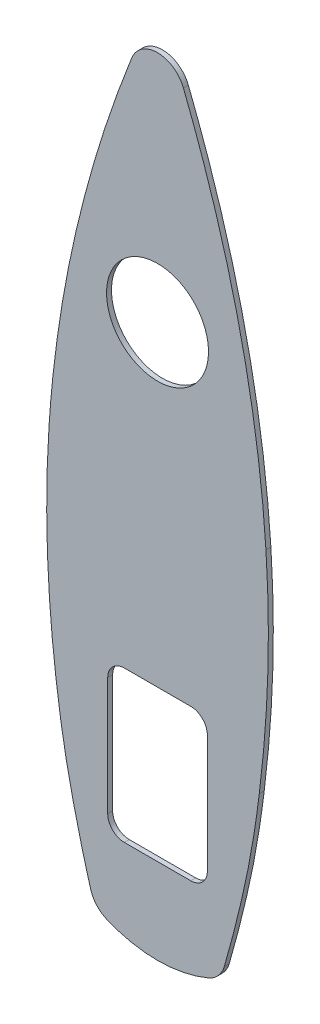
ISO-10303-21;
HEADER;
FILE_DESCRIPTION(('STEP AP214'),'2;1');
FILE_NAME('part.step','',(''),(''),'','','');
FILE_SCHEMA(('AUTOMOTIVE_DESIGN { 1 0 10303 214 1 1 1 1 }'));
ENDSEC;
DATA;
#1=APPLICATION_CONTEXT('core data for automotive mechanical design processes');
#2=APPLICATION_PROTOCOL_DEFINITION('international standard','automotive_design',2000,#1);
#3=PRODUCT_CONTEXT('',#1,'mechanical');
#4=PRODUCT('Part','Part','',(#3));
#5=PRODUCT_RELATED_PRODUCT_CATEGORY('part','',(#4));
#6=PRODUCT_DEFINITION_FORMATION('','',#4);
#7=PRODUCT_DEFINITION_CONTEXT('part definition',#1,'design');
#8=PRODUCT_DEFINITION('design','',#6,#7);
#9=PRODUCT_DEFINITION_SHAPE('','',#8);
#10=(LENGTH_UNIT() NAMED_UNIT(*) SI_UNIT(.MILLI.,.METRE.));
#11=(NAMED_UNIT(*) PLANE_ANGLE_UNIT() SI_UNIT($,.RADIAN.));
#12=(NAMED_UNIT(*) SI_UNIT($,.STERADIAN.) SOLID_ANGLE_UNIT());
#13=UNCERTAINTY_MEASURE_WITH_UNIT(LENGTH_MEASURE(1.E-05),#10,'distance_accuracy_value','');
#14=(GEOMETRIC_REPRESENTATION_CONTEXT(3) GLOBAL_UNCERTAINTY_ASSIGNED_CONTEXT((#13)) GLOBAL_UNIT_ASSIGNED_CONTEXT((#10,
#11,#12)) REPRESENTATION_CONTEXT('',''));
#15=CARTESIAN_POINT('',(0.,0.,0.));
#16=DIRECTION('',(0.,0.,1.));
#17=DIRECTION('',(1.,0.,0.));
#18=AXIS2_PLACEMENT_3D('',#15,#16,#17);
#19=CARTESIAN_POINT('',(-169.07570062882,-111.71211736926,-9.525));
#20=DIRECTION('',(0.,0.,1.));
#21=DIRECTION('',(1.,0.,0.));
#22=AXIS2_PLACEMENT_3D('',#19,#20,#21);
#23=PLANE('',#22);
#24=CARTESIAN_POINT('',(-196.097381589858,50.8000000000001,-9.525));
#25=CARTESIAN_POINT('',(-194.466912187164,37.7211454825166,-9.525));
#26=CARTESIAN_POINT('',(-190.233865689796,5.92326819002525,-9.525));
#27=CARTESIAN_POINT('',(-182.43760031694,-44.4187056096988,-9.525));
#28=CARTESIAN_POINT('',(-173.662799668192,-90.6349064624784,-9.525));
#29=CARTESIAN_POINT('',(-165.684623460225,-127.462722699776,-9.525));
#30=CARTESIAN_POINT('',(-159.273671103967,-155.047248490018,-9.525));
#31=CARTESIAN_POINT('',(-152.54164904012,-182.662401272934,-9.525));
#32=CARTESIAN_POINT('',(-145.58749855478,-210.232026724361,-9.525));
#33=CARTESIAN_POINT('',(-138.372363082365,-237.609630025993,-9.525));
#34=CARTESIAN_POINT('',(-132.92675238019,-256.894775015063,-9.525));
#35=CARTESIAN_POINT('',(-129.60700992947,-268.248148567474,-9.525));
#36=CARTESIAN_POINT('',(-128.929001137136,-270.550670561153,-9.525));
#37=CARTESIAN_POINT('',(-128.594557170708,-271.683003432127,-9.525));
#38=B_SPLINE_CURVE_WITH_KNOTS('',3,(#24,#25,#26,#27,#28,#29,#30,#31,#32,#33,#34,#35,#36,#37),
.UNSPECIFIED.,.F.,.F.,(4,1,1,1,1,1,1,1,1,1,1,4),(0.178448908542839,0.221760146261154,
0.283875320117554,0.345990493973954,0.377048080902154,0.408105667830354,0.439163254758554,
0.470220841686754,0.501278428614955,0.532336015543155,0.536350430203491,0.540232628569516),.UNSPECIFIED.);
#39=CARTESIAN_POINT('',(-196.097381589858,50.8000000000001,-9.525));
#40=VERTEX_POINT('',#39);
#41=CARTESIAN_POINT('',(-128.594557170708,-271.683003432127,-9.525));
#42=VERTEX_POINT('',#41);
#43=EDGE_CURVE('E179',#40,#42,#38,.T.);
#44=ORIENTED_EDGE('',*,*,#43,.F.);
#45=CARTESIAN_POINT('',(-208.92314552271,463.823648230864,-9.525));
#46=CARTESIAN_POINT('',(-210.176488679668,444.979630563106,-9.525));
#47=CARTESIAN_POINT('',(-212.168857378131,407.250169642296,-9.525));
#48=CARTESIAN_POINT('',(-214.13290576606,331.756352430611,-9.525));
#49=CARTESIAN_POINT('',(-213.041680780729,256.162202934723,-9.525));
#50=CARTESIAN_POINT('',(-208.913068108199,180.752800745102,-9.525));
#51=CARTESIAN_POINT('',(-204.336033540581,124.225867737426,-9.525));
#52=CARTESIAN_POINT('',(-199.763447663843,80.9264416222707,-9.525));
#53=CARTESIAN_POINT('',(-196.805263519319,56.4782940886052,-9.525));
#54=CARTESIAN_POINT('',(-196.097381589858,50.8000000000001,-9.525));
#55=B_SPLINE_CURVE_WITH_KNOTS('',3,(#45,#46,#47,#48,#49,#50,#51,#52,#53,#54),.UNSPECIFIED.,.F.,
.F.,(4,1,1,1,1,1,1,4),(0.540232628569516,0.602347802425916,0.664462976282317,0.788693323995117,
0.850808497851517,0.912923671707918,0.975038845564318,0.993842781702403),.UNSPECIFIED.);
#56=CARTESIAN_POINT('',(-208.92314552271,463.823648230864,-9.525));
#57=VERTEX_POINT('',#56);
#58=EDGE_CURVE('E173',#57,#40,#55,.T.);
#59=ORIENTED_EDGE('',*,*,#58,.F.);
#60=CARTESIAN_POINT('',(-49.8587186123013,1155.17345557115,-9.525));
#61=CARTESIAN_POINT('',(-50.0302403870393,1154.73560842821,-9.525));
#62=CARTESIAN_POINT('',(-51.5170168797644,1150.938010972,-9.525));
#63=CARTESIAN_POINT('',(-54.3644267921593,1143.62077292858,-9.525));
#64=CARTESIAN_POINT('',(-58.4009920401104,1133.20563378004,-9.525));
#65=CARTESIAN_POINT('',(-66.4915866512016,1112.15093240454,-9.525));
#66=CARTESIAN_POINT('',(-78.262605190458,1080.4804198646,-9.525));
#67=CARTESIAN_POINT('',(-93.1475011129892,1037.90347260421,-9.525));
#68=CARTESIAN_POINT('',(-111.913437804513,980.768947108171,-9.525));
#69=CARTESIAN_POINT('',(-133.34925540427,908.643148931544,-9.525));
#70=CARTESIAN_POINT('',(-152.011482075015,835.667387936842,-9.525));
#71=CARTESIAN_POINT('',(-165.195396161111,776.883168245489,-9.525));
#72=CARTESIAN_POINT('',(-177.216824309124,717.77767186812,-9.525));
#73=CARTESIAN_POINT('',(-189.991146999518,643.543237919497,-9.525));
#74=CARTESIAN_POINT('',(-199.706639723368,568.910060357193,-9.525));
#75=CARTESIAN_POINT('',(-205.602175882465,508.953742276428,-9.525));
#76=CARTESIAN_POINT('',(-207.922427582032,478.869564138098,-9.525));
#77=CARTESIAN_POINT('',(-208.92314552271,463.823648230864,-9.525));
#78=B_SPLINE_CURVE_WITH_KNOTS('',3,(#60,#61,#62,#63,#64,#65,#66,#67,#68,#69,#70,#71,#72,#73,#74,
#75,#76,#77),.UNSPECIFIED.,.F.,.F.,(4,1,1,1,1,1,1,1,1,1,1,1,1,1,1,4),(0.,0.0019525801139515,
0.0169372392647247,0.0325578801763373,0.0481785210879501,0.110661084734401,0.173143648380851,
0.235626212027302,0.360591339320203,0.485556466613104,0.548039030259555,0.610521593906006,
0.735486721198907,0.860451848491808,0.922934412138259,0.98541697578471),.UNSPECIFIED.);
#79=CARTESIAN_POINT('',(-49.8587186123014,1155.17345557115,-9.525));
#80=VERTEX_POINT('',#79);
#81=EDGE_CURVE('E246',#80,#57,#78,.T.);
#82=ORIENTED_EDGE('',*,*,#81,.F.);
#83=CARTESIAN_POINT('',(0.,1135.64185396908,-9.525));
#84=DIRECTION('',(0.,0.,1.));
#85=DIRECTION('',(1.,0.,0.));
#86=AXIS2_PLACEMENT_3D('',#83,#84,#85);
#87=CIRCLE('',#86,53.5478784155137);
#88=CARTESIAN_POINT('',(49.8587186123014,1155.17345557115,-9.525));
#89=VERTEX_POINT('',#88);
#90=EDGE_CURVE('E569',#89,#80,#87,.T.);
#91=ORIENTED_EDGE('',*,*,#90,.F.);
#92=CARTESIAN_POINT('',(208.92314552271,463.823648230864,-9.525));
#93=CARTESIAN_POINT('',(207.922427582032,478.869564138098,-9.525));
#94=CARTESIAN_POINT('',(205.602175882466,508.953742276428,-9.525));
#95=CARTESIAN_POINT('',(199.706639723368,568.910060357193,-9.525));
#96=CARTESIAN_POINT('',(189.991146999518,643.543237919497,-9.525));
#97=CARTESIAN_POINT('',(177.216824309124,717.77767186812,-9.525));
#98=CARTESIAN_POINT('',(165.195396161111,776.883168245489,-9.525));
#99=CARTESIAN_POINT('',(152.011482075015,835.667387936842,-9.525));
#100=CARTESIAN_POINT('',(133.349255404271,908.643148931544,-9.525));
#101=CARTESIAN_POINT('',(111.913437804513,980.768947108171,-9.525));
#102=CARTESIAN_POINT('',(93.1475011129891,1037.90347260421,-9.525));
#103=CARTESIAN_POINT('',(78.2626051904581,1080.4804198646,-9.525));
#104=CARTESIAN_POINT('',(66.4915866512016,1112.15093240454,-9.525));
#105=CARTESIAN_POINT('',(58.4009920401104,1133.20563378004,-9.525));
#106=CARTESIAN_POINT('',(54.3644267921593,1143.62077292858,-9.525));
#107=CARTESIAN_POINT('',(51.5170168797644,1150.938010972,-9.525));
#108=CARTESIAN_POINT('',(50.0302403870394,1154.73560842821,-9.525));
#109=CARTESIAN_POINT('',(49.8587186123014,1155.17345557115,-9.525));
#110=B_SPLINE_CURVE_WITH_KNOTS('',3,(#92,#93,#94,#95,#96,#97,#98,#99,#100,#101,#102,#103,#104,
#105,#106,#107,#108,#109),.UNSPECIFIED.,.F.,.F.,(4,1,1,1,1,1,1,1,1,1,1,1,1,1,1,4),(0.,
0.0624825636464506,0.124965127292901,0.249930254585803,0.374895381878704,0.437377945525154,
0.499860509171605,0.624825636464506,0.749790763757408,0.812273327403858,0.874755891050309,
0.937238454696759,0.952859095608372,0.968479736519985,0.983464395670758,0.98541697578471),.UNSPECIFIED.);
#111=CARTESIAN_POINT('',(208.92314552271,463.823648230864,-9.525));
#112=VERTEX_POINT('',#111);
#113=EDGE_CURVE('E572',#112,#89,#110,.T.);
#114=ORIENTED_EDGE('',*,*,#113,.F.);
#115=CARTESIAN_POINT('',(196.097381589858,50.8,-9.525));
#116=CARTESIAN_POINT('',(196.805263519319,56.4782940886051,-9.525));
#117=CARTESIAN_POINT('',(199.763447663843,80.9264416222707,-9.525));
#118=CARTESIAN_POINT('',(204.336033540581,124.225867737426,-9.525));
#119=CARTESIAN_POINT('',(208.913068108199,180.752800745102,-9.525));
#120=CARTESIAN_POINT('',(213.041680780729,256.162202934723,-9.525));
#121=CARTESIAN_POINT('',(214.13290576606,331.756352430611,-9.525));
#122=CARTESIAN_POINT('',(212.168857378131,407.250169642296,-9.525));
#123=CARTESIAN_POINT('',(210.176488679668,444.979630563106,-9.525));
#124=CARTESIAN_POINT('',(208.92314552271,463.823648230864,-9.525));
#125=B_SPLINE_CURVE_WITH_KNOTS('',3,(#115,#116,#117,#118,#119,#120,#121,#122,#123,#124),
.UNSPECIFIED.,.F.,.F.,(4,1,1,1,1,1,1,4),(0.540232628569516,0.559036564707602,0.621151738564002,
0.683266912420402,0.745382086276803,0.869612433989603,0.931727607846003,0.993842781702403),.UNSPECIFIED.);
#126=CARTESIAN_POINT('',(196.097381589858,50.8,-9.525));
#127=VERTEX_POINT('',#126);
#128=EDGE_CURVE('E573',#127,#112,#125,.T.);
#129=ORIENTED_EDGE('',*,*,#128,.F.);
#130=CARTESIAN_POINT('',(128.594557170708,-271.683003432127,-9.525));
#131=CARTESIAN_POINT('',(128.929001137136,-270.550670561153,-9.525));
#132=CARTESIAN_POINT('',(129.60700992947,-268.248148567474,-9.525));
#133=CARTESIAN_POINT('',(132.92675238019,-256.894775015063,-9.525));
#134=CARTESIAN_POINT('',(138.372363082365,-237.609630025993,-9.525));
#135=CARTESIAN_POINT('',(145.58749855478,-210.232026724361,-9.525));
#136=CARTESIAN_POINT('',(152.54164904012,-182.662401272934,-9.525));
#137=CARTESIAN_POINT('',(159.273671103967,-155.047248490018,-9.525));
#138=CARTESIAN_POINT('',(165.684623460225,-127.462722699776,-9.525));
#139=CARTESIAN_POINT('',(173.662799668192,-90.6349064624784,-9.525));
#140=CARTESIAN_POINT('',(182.43760031694,-44.4187056096988,-9.525));
#141=CARTESIAN_POINT('',(190.233865689796,5.92326819002522,-9.525));
#142=CARTESIAN_POINT('',(194.466912187164,37.7211454825165,-9.525));
#143=CARTESIAN_POINT('',(196.097381589858,50.8,-9.525));
#144=B_SPLINE_CURVE_WITH_KNOTS('',3,(#130,#131,#132,#133,#134,#135,#136,#137,#138,#139,#140,
#141,#142,#143),.UNSPECIFIED.,.F.,.F.,(4,1,1,1,1,1,1,1,1,1,1,4),(0.178448908542839,
0.182331106908864,0.186345521569201,0.217403108497401,0.248460695425601,0.279518282353801,
0.310575869282001,0.341633456210201,0.372691043138401,0.434806216994801,0.496921390851202,
0.540232628569516),.UNSPECIFIED.);
#145=CARTESIAN_POINT('',(128.594557170708,-271.683003432127,-9.525));
#146=VERTEX_POINT('',#145);
#147=EDGE_CURVE('E586',#146,#127,#144,.T.);
#148=ORIENTED_EDGE('',*,*,#147,.F.);
#149=CARTESIAN_POINT('',(77.2378166373503,-256.514361377239,-9.525));
#150=DIRECTION('',(0.,0.,1.));
#151=DIRECTION('',(1.,0.,0.));
#152=AXIS2_PLACEMENT_3D('',#149,#150,#151);
#153=CIRCLE('',#152,53.5499999999992);
#154=CARTESIAN_POINT('',(98.0313358756742,-305.862431832783,-9.525));
#155=VERTEX_POINT('',#154);
#156=EDGE_CURVE('E592',#155,#146,#153,.T.);
#157=ORIENTED_EDGE('',*,*,#156,.F.);
#158=CARTESIAN_POINT('',(0.,-73.210266790526,-9.525));
#159=DIRECTION('',(0.,0.,1.));
#160=DIRECTION('',(1.,0.,0.));
#161=AXIS2_PLACEMENT_3D('',#158,#159,#160);
#162=CIRCLE('',#161,252.46222036657);
#163=CARTESIAN_POINT('',(-98.0313358756743,-305.862431832783,-9.525));
#164=VERTEX_POINT('',#163);
#165=EDGE_CURVE('E183',#164,#155,#162,.T.);
#166=ORIENTED_EDGE('',*,*,#165,.F.);
#167=CARTESIAN_POINT('',(-77.2378166373503,-256.514361377239,-9.525));
#168=DIRECTION('',(0.,0.,1.));
#169=DIRECTION('',(1.,0.,0.));
#170=AXIS2_PLACEMENT_3D('',#167,#168,#169);
#171=CIRCLE('',#170,53.5499999999992);
#172=EDGE_CURVE('E165',#42,#164,#171,.T.);
#173=ORIENTED_EDGE('',*,*,#172,.F.);
#174=EDGE_LOOP('',(#44,#59,#82,#91,#114,#129,#148,#157,#166,#173));
#175=FACE_BOUND('',#174,.T.);
#176=DIRECTION('',(-1.,0.,0.));
#177=VECTOR('',#176,1.);
#178=CARTESIAN_POINT('',(-169.07570062882,-160.672487157329,-9.525));
#179=LINE('',#178,#177);
#180=CARTESIAN_POINT('',(64.,-160.672487157329,-9.525));
#181=VERTEX_POINT('',#180);
#182=CARTESIAN_POINT('',(-64.,-160.672487157329,-9.525));
#183=VERTEX_POINT('',#182);
#184=EDGE_CURVE('E339',#181,#183,#179,.T.);
#185=ORIENTED_EDGE('',*,*,#184,.F.);
#186=CARTESIAN_POINT('',(64.,-128.672487157329,-9.525));
#187=DIRECTION('',(0.,0.,1.));
#188=DIRECTION('',(1.,0.,0.));
#189=AXIS2_PLACEMENT_3D('',#186,#187,#188);
#190=CIRCLE('',#189,32.);
#191=CARTESIAN_POINT('',(96.,-128.672487157329,-9.525));
#192=VERTEX_POINT('',#191);
#193=EDGE_CURVE('E358',#181,#192,#190,.T.);
#194=ORIENTED_EDGE('',*,*,#193,.T.);
#195=DIRECTION('',(0.,-1.,0.));
#196=VECTOR('',#195,1.);
#197=CARTESIAN_POINT('',(96.,-111.71211736926,-9.525));
#198=LINE('',#197,#196);
#199=CARTESIAN_POINT('',(96.,98.3275128426711,-9.525));
#200=VERTEX_POINT('',#199);
#201=EDGE_CURVE('E375',#200,#192,#198,.T.);
#202=ORIENTED_EDGE('',*,*,#201,.F.);
#203=CARTESIAN_POINT('',(64.,98.3275128426712,-9.525));
#204=DIRECTION('',(0.,0.,1.));
#205=DIRECTION('',(1.,0.,0.));
#206=AXIS2_PLACEMENT_3D('',#203,#204,#205);
#207=CIRCLE('',#206,32.);
#208=CARTESIAN_POINT('',(64.,130.327512842671,-9.525));
#209=VERTEX_POINT('',#208);
#210=EDGE_CURVE('E362',#200,#209,#207,.T.);
#211=ORIENTED_EDGE('',*,*,#210,.T.);
#212=DIRECTION('',(-1.,0.,0.));
#213=VECTOR('',#212,1.);
#214=CARTESIAN_POINT('',(-169.07570062882,130.327512842671,-9.525));
#215=LINE('',#214,#213);
#216=CARTESIAN_POINT('',(-64.,130.327512842671,-9.525));
#217=VERTEX_POINT('',#216);
#218=EDGE_CURVE('E389',#209,#217,#215,.T.);
#219=ORIENTED_EDGE('',*,*,#218,.T.);
#220=CARTESIAN_POINT('',(-64.,98.3275128426712,-9.525));
#221=DIRECTION('',(0.,0.,1.));
#222=DIRECTION('',(1.,0.,0.));
#223=AXIS2_PLACEMENT_3D('',#220,#221,#222);
#224=CIRCLE('',#223,32.);
#225=CARTESIAN_POINT('',(-96.,98.3275128426711,-9.525));
#226=VERTEX_POINT('',#225);
#227=EDGE_CURVE('E59',#217,#226,#224,.T.);
#228=ORIENTED_EDGE('',*,*,#227,.T.);
#229=DIRECTION('',(0.,-1.,0.));
#230=VECTOR('',#229,1.);
#231=CARTESIAN_POINT('',(-96.,-111.71211736926,-9.525));
#232=LINE('',#231,#230);
#233=CARTESIAN_POINT('',(-96.,-128.672487157329,-9.525));
#234=VERTEX_POINT('',#233);
#235=EDGE_CURVE('E371',#226,#234,#232,.T.);
#236=ORIENTED_EDGE('',*,*,#235,.T.);
#237=CARTESIAN_POINT('',(-64.,-128.672487157329,-9.525));
#238=DIRECTION('',(0.,0.,1.));
#239=DIRECTION('',(1.,0.,0.));
#240=AXIS2_PLACEMENT_3D('',#237,#238,#239);
#241=CIRCLE('',#240,32.);
#242=EDGE_CURVE('E45',#234,#183,#241,.T.);
#243=ORIENTED_EDGE('',*,*,#242,.T.);
#244=EDGE_LOOP('',(#185,#194,#202,#211,#219,#228,#236,#243));
#245=FACE_BOUND('',#244,.T.);
#246=CARTESIAN_POINT('',(0.,739.189732384592,-9.525));
#247=DIRECTION('',(0.,0.,1.));
#248=DIRECTION('',(1.,0.,0.));
#249=AXIS2_PLACEMENT_3D('',#246,#247,#248);
#250=CIRCLE('',#249,98.25);
#251=CARTESIAN_POINT('',(98.2500000000001,739.189732384592,-9.525));
#252=VERTEX_POINT('',#251);
#253=EDGE_CURVE('E196',#252,#252,#250,.F.);
#254=ORIENTED_EDGE('',*,*,#253,.F.);
#255=EDGE_LOOP('',(#254));
#256=FACE_BOUND('',#255,.T.);
#257=ADVANCED_FACE('F37',(#175,#245,#256),#23,.F.);
#258=CARTESIAN_POINT('',(-169.07570062882,-111.71211736926,0.));
#259=DIRECTION('',(0.,0.,1.));
#260=DIRECTION('',(1.,0.,0.));
#261=AXIS2_PLACEMENT_3D('',#258,#259,#260);
#262=PLANE('',#261);
#263=DIRECTION('',(-1.,0.,0.));
#264=VECTOR('',#263,1.);
#265=CARTESIAN_POINT('',(-169.07570062882,130.327512842671,0.));
#266=LINE('',#265,#264);
#267=CARTESIAN_POINT('',(64.,130.327512842671,0.));
#268=VERTEX_POINT('',#267);
#269=CARTESIAN_POINT('',(-64.,130.327512842671,0.));
#270=VERTEX_POINT('',#269);
#271=EDGE_CURVE('E326',#268,#270,#266,.T.);
#272=ORIENTED_EDGE('',*,*,#271,.F.);
#273=CARTESIAN_POINT('',(64.,98.3275128426712,0.));
#274=DIRECTION('',(0.,0.,1.));
#275=DIRECTION('',(1.,0.,0.));
#276=AXIS2_PLACEMENT_3D('',#273,#274,#275);
#277=CIRCLE('',#276,32.);
#278=CARTESIAN_POINT('',(96.,98.3275128426711,0.));
#279=VERTEX_POINT('',#278);
#280=EDGE_CURVE('E364',#268,#279,#277,.F.);
#281=ORIENTED_EDGE('',*,*,#280,.T.);
#282=DIRECTION('',(0.,-1.,0.));
#283=VECTOR('',#282,1.);
#284=CARTESIAN_POINT('',(96.,-111.71211736926,0.));
#285=LINE('',#284,#283);
#286=CARTESIAN_POINT('',(96.,-128.672487157329,0.));
#287=VERTEX_POINT('',#286);
#288=EDGE_CURVE('E329',#279,#287,#285,.T.);
#289=ORIENTED_EDGE('',*,*,#288,.T.);
#290=CARTESIAN_POINT('',(64.,-128.672487157329,0.));
#291=DIRECTION('',(0.,0.,1.));
#292=DIRECTION('',(1.,0.,0.));
#293=AXIS2_PLACEMENT_3D('',#290,#291,#292);
#294=CIRCLE('',#293,32.);
#295=CARTESIAN_POINT('',(64.,-160.672487157329,0.));
#296=VERTEX_POINT('',#295);
#297=EDGE_CURVE('E360',#287,#296,#294,.F.);
#298=ORIENTED_EDGE('',*,*,#297,.T.);
#299=DIRECTION('',(-1.,0.,0.));
#300=VECTOR('',#299,1.);
#301=CARTESIAN_POINT('',(-169.07570062882,-160.672487157329,0.));
#302=LINE('',#301,#300);
#303=CARTESIAN_POINT('',(-64.,-160.672487157329,0.));
#304=VERTEX_POINT('',#303);
#305=EDGE_CURVE('E332',#296,#304,#302,.T.);
#306=ORIENTED_EDGE('',*,*,#305,.T.);
#307=CARTESIAN_POINT('',(-64.,-128.672487157329,0.));
#308=DIRECTION('',(0.,0.,1.));
#309=DIRECTION('',(1.,0.,0.));
#310=AXIS2_PLACEMENT_3D('',#307,#308,#309);
#311=CIRCLE('',#310,32.);
#312=CARTESIAN_POINT('',(-96.,-128.672487157329,0.));
#313=VERTEX_POINT('',#312);
#314=EDGE_CURVE('E11',#304,#313,#311,.F.);
#315=ORIENTED_EDGE('',*,*,#314,.T.);
#316=DIRECTION('',(0.,-1.,0.));
#317=VECTOR('',#316,1.);
#318=CARTESIAN_POINT('',(-96.,-111.71211736926,0.));
#319=LINE('',#318,#317);
#320=CARTESIAN_POINT('',(-96.,98.3275128426711,0.));
#321=VERTEX_POINT('',#320);
#322=EDGE_CURVE('E308',#321,#313,#319,.T.);
#323=ORIENTED_EDGE('',*,*,#322,.F.);
#324=CARTESIAN_POINT('',(-64.,98.3275128426712,0.));
#325=DIRECTION('',(0.,0.,1.));
#326=DIRECTION('',(1.,0.,0.));
#327=AXIS2_PLACEMENT_3D('',#324,#325,#326);
#328=CIRCLE('',#327,32.);
#329=EDGE_CURVE('E367',#321,#270,#328,.F.);
#330=ORIENTED_EDGE('',*,*,#329,.T.);
#331=EDGE_LOOP('',(#272,#281,#289,#298,#306,#315,#323,#330));
#332=FACE_BOUND('',#331,.T.);
#333=CARTESIAN_POINT('',(-196.097381589858,50.8000000000001,0.));
#334=CARTESIAN_POINT('',(-194.466912187164,37.7211454825166,0.));
#335=CARTESIAN_POINT('',(-190.233865689796,5.92326819002525,0.));
#336=CARTESIAN_POINT('',(-182.43760031694,-44.4187056096988,0.));
#337=CARTESIAN_POINT('',(-173.662799668192,-90.6349064624784,0.));
#338=CARTESIAN_POINT('',(-165.684623460225,-127.462722699776,0.));
#339=CARTESIAN_POINT('',(-159.273671103967,-155.047248490018,0.));
#340=CARTESIAN_POINT('',(-152.54164904012,-182.662401272934,0.));
#341=CARTESIAN_POINT('',(-145.58749855478,-210.232026724361,0.));
#342=CARTESIAN_POINT('',(-138.372363082365,-237.609630025993,0.));
#343=CARTESIAN_POINT('',(-132.92675238019,-256.894775015063,0.));
#344=CARTESIAN_POINT('',(-129.60700992947,-268.248148567474,0.));
#345=CARTESIAN_POINT('',(-128.929001137136,-270.550670561153,0.));
#346=CARTESIAN_POINT('',(-128.594557170708,-271.683003432127,0.));
#347=B_SPLINE_CURVE_WITH_KNOTS('',3,(#333,#334,#335,#336,#337,#338,#339,#340,#341,#342,#343,
#344,#345,#346),.UNSPECIFIED.,.F.,.F.,(4,1,1,1,1,1,1,1,1,1,1,4),(0.178448908542839,
0.221760146261154,0.283875320117554,0.345990493973954,0.377048080902154,0.408105667830354,
0.439163254758554,0.470220841686754,0.501278428614955,0.532336015543155,0.536350430203491,
0.540232628569516),.UNSPECIFIED.);
#348=CARTESIAN_POINT('',(-196.097381589858,50.8000000000001,0.));
#349=VERTEX_POINT('',#348);
#350=CARTESIAN_POINT('',(-128.594557170708,-271.683003432127,0.));
#351=VERTEX_POINT('',#350);
#352=EDGE_CURVE('E251',#349,#351,#347,.T.);
#353=ORIENTED_EDGE('',*,*,#352,.T.);
#354=CARTESIAN_POINT('',(-77.2378166373503,-256.514361377239,0.));
#355=DIRECTION('',(0.,0.,1.));
#356=DIRECTION('',(1.,0.,0.));
#357=AXIS2_PLACEMENT_3D('',#354,#355,#356);
#358=CIRCLE('',#357,53.5499999999992);
#359=CARTESIAN_POINT('',(-98.0313358756743,-305.862431832783,0.));
#360=VERTEX_POINT('',#359);
#361=EDGE_CURVE('E167',#351,#360,#358,.T.);
#362=ORIENTED_EDGE('',*,*,#361,.T.);
#363=CARTESIAN_POINT('',(0.,-73.210266790526,0.));
#364=DIRECTION('',(0.,0.,1.));
#365=DIRECTION('',(1.,0.,0.));
#366=AXIS2_PLACEMENT_3D('',#363,#364,#365);
#367=CIRCLE('',#366,252.46222036657);
#368=CARTESIAN_POINT('',(98.0313358756742,-305.862431832783,0.));
#369=VERTEX_POINT('',#368);
#370=EDGE_CURVE('E262',#360,#369,#367,.T.);
#371=ORIENTED_EDGE('',*,*,#370,.T.);
#372=CARTESIAN_POINT('',(77.2378166373503,-256.514361377239,0.));
#373=DIRECTION('',(0.,0.,1.));
#374=DIRECTION('',(1.,0.,0.));
#375=AXIS2_PLACEMENT_3D('',#372,#373,#374);
#376=CIRCLE('',#375,53.5499999999992);
#377=CARTESIAN_POINT('',(128.594557170708,-271.683003432127,0.));
#378=VERTEX_POINT('',#377);
#379=EDGE_CURVE('E265',#369,#378,#376,.T.);
#380=ORIENTED_EDGE('',*,*,#379,.T.);
#381=CARTESIAN_POINT('',(128.594557170708,-271.683003432127,0.));
#382=CARTESIAN_POINT('',(128.929001137136,-270.550670561153,0.));
#383=CARTESIAN_POINT('',(129.60700992947,-268.248148567474,0.));
#384=CARTESIAN_POINT('',(132.92675238019,-256.894775015063,0.));
#385=CARTESIAN_POINT('',(138.372363082365,-237.609630025993,0.));
#386=CARTESIAN_POINT('',(145.58749855478,-210.232026724361,0.));
#387=CARTESIAN_POINT('',(152.54164904012,-182.662401272934,0.));
#388=CARTESIAN_POINT('',(159.273671103967,-155.047248490018,0.));
#389=CARTESIAN_POINT('',(165.684623460225,-127.462722699776,0.));
#390=CARTESIAN_POINT('',(173.662799668192,-90.6349064624784,0.));
#391=CARTESIAN_POINT('',(182.43760031694,-44.4187056096988,0.));
#392=CARTESIAN_POINT('',(190.233865689796,5.92326819002522,0.));
#393=CARTESIAN_POINT('',(194.466912187164,37.7211454825165,0.));
#394=CARTESIAN_POINT('',(196.097381589858,50.8,0.));
#395=B_SPLINE_CURVE_WITH_KNOTS('',3,(#381,#382,#383,#384,#385,#386,#387,#388,#389,#390,#391,
#392,#393,#394),.UNSPECIFIED.,.F.,.F.,(4,1,1,1,1,1,1,1,1,1,1,4),(0.178448908542839,
0.182331106908864,0.186345521569201,0.217403108497401,0.248460695425601,0.279518282353801,
0.310575869282001,0.341633456210201,0.372691043138401,0.434806216994801,0.496921390851202,
0.540232628569516),.UNSPECIFIED.);
#396=CARTESIAN_POINT('',(196.097381589858,50.8,0.));
#397=VERTEX_POINT('',#396);
#398=EDGE_CURVE('E268',#378,#397,#395,.T.);
#399=ORIENTED_EDGE('',*,*,#398,.T.);
#400=CARTESIAN_POINT('',(196.097381589858,50.8,0.));
#401=CARTESIAN_POINT('',(196.805263519319,56.4782940886051,0.));
#402=CARTESIAN_POINT('',(199.763447663843,80.9264416222707,0.));
#403=CARTESIAN_POINT('',(204.336033540581,124.225867737426,0.));
#404=CARTESIAN_POINT('',(208.913068108199,180.752800745102,0.));
#405=CARTESIAN_POINT('',(213.041680780729,256.162202934723,0.));
#406=CARTESIAN_POINT('',(214.13290576606,331.756352430611,0.));
#407=CARTESIAN_POINT('',(212.168857378131,407.250169642296,0.));
#408=CARTESIAN_POINT('',(210.176488679668,444.979630563106,0.));
#409=CARTESIAN_POINT('',(208.92314552271,463.823648230864,0.));
#410=B_SPLINE_CURVE_WITH_KNOTS('',3,(#400,#401,#402,#403,#404,#405,#406,#407,#408,#409),
.UNSPECIFIED.,.F.,.F.,(4,1,1,1,1,1,1,4),(0.540232628569516,0.559036564707602,0.621151738564002,
0.683266912420402,0.745382086276803,0.869612433989603,0.931727607846003,0.993842781702403),.UNSPECIFIED.);
#411=CARTESIAN_POINT('',(208.92314552271,463.823648230864,0.));
#412=VERTEX_POINT('',#411);
#413=EDGE_CURVE('E273',#397,#412,#410,.T.);
#414=ORIENTED_EDGE('',*,*,#413,.T.);
#415=CARTESIAN_POINT('',(208.92314552271,463.823648230864,0.));
#416=CARTESIAN_POINT('',(207.922427582032,478.869564138098,0.));
#417=CARTESIAN_POINT('',(205.602175882466,508.953742276428,0.));
#418=CARTESIAN_POINT('',(199.706639723368,568.910060357193,0.));
#419=CARTESIAN_POINT('',(189.991146999518,643.543237919497,0.));
#420=CARTESIAN_POINT('',(177.216824309124,717.77767186812,0.));
#421=CARTESIAN_POINT('',(165.195396161111,776.883168245489,0.));
#422=CARTESIAN_POINT('',(152.011482075015,835.667387936842,0.));
#423=CARTESIAN_POINT('',(133.349255404271,908.643148931544,0.));
#424=CARTESIAN_POINT('',(111.913437804513,980.768947108171,0.));
#425=CARTESIAN_POINT('',(93.1475011129891,1037.90347260421,0.));
#426=CARTESIAN_POINT('',(78.2626051904581,1080.4804198646,0.));
#427=CARTESIAN_POINT('',(66.4915866512016,1112.15093240454,0.));
#428=CARTESIAN_POINT('',(58.4009920401104,1133.20563378004,0.));
#429=CARTESIAN_POINT('',(54.3644267921593,1143.62077292858,0.));
#430=CARTESIAN_POINT('',(51.5170168797644,1150.938010972,0.));
#431=CARTESIAN_POINT('',(50.0302403870394,1154.73560842821,0.));
#432=CARTESIAN_POINT('',(49.8587186123014,1155.17345557115,0.));
#433=B_SPLINE_CURVE_WITH_KNOTS('',3,(#415,#416,#417,#418,#419,#420,#421,#422,#423,#424,#425,
#426,#427,#428,#429,#430,#431,#432),.UNSPECIFIED.,.F.,.F.,(4,1,1,1,1,1,1,1,1,1,1,1,1,1,1,4),(0.,
0.0624825636464506,0.124965127292901,0.249930254585803,0.374895381878704,0.437377945525154,
0.499860509171605,0.624825636464506,0.749790763757408,0.812273327403858,0.874755891050309,
0.937238454696759,0.952859095608372,0.968479736519985,0.983464395670758,0.98541697578471),.UNSPECIFIED.);
#434=CARTESIAN_POINT('',(49.8587186123014,1155.17345557115,0.));
#435=VERTEX_POINT('',#434);
#436=EDGE_CURVE('E281',#412,#435,#433,.T.);
#437=ORIENTED_EDGE('',*,*,#436,.T.);
#438=CARTESIAN_POINT('',(0.,1135.64185396908,0.));
#439=DIRECTION('',(0.,0.,1.));
#440=DIRECTION('',(1.,0.,0.));
#441=AXIS2_PLACEMENT_3D('',#438,#439,#440);
#442=CIRCLE('',#441,53.5478784155137);
#443=CARTESIAN_POINT('',(-49.8587186123014,1155.17345557115,0.));
#444=VERTEX_POINT('',#443);
#445=EDGE_CURVE('E289',#435,#444,#442,.T.);
#446=ORIENTED_EDGE('',*,*,#445,.T.);
#447=CARTESIAN_POINT('',(-49.8587186123013,1155.17345557115,0.));
#448=CARTESIAN_POINT('',(-50.0302403870393,1154.73560842821,0.));
#449=CARTESIAN_POINT('',(-51.5170168797644,1150.938010972,0.));
#450=CARTESIAN_POINT('',(-54.3644267921593,1143.62077292858,0.));
#451=CARTESIAN_POINT('',(-58.4009920401104,1133.20563378004,0.));
#452=CARTESIAN_POINT('',(-66.4915866512016,1112.15093240454,0.));
#453=CARTESIAN_POINT('',(-78.262605190458,1080.4804198646,0.));
#454=CARTESIAN_POINT('',(-93.1475011129892,1037.90347260421,0.));
#455=CARTESIAN_POINT('',(-111.913437804513,980.768947108171,0.));
#456=CARTESIAN_POINT('',(-133.34925540427,908.643148931544,0.));
#457=CARTESIAN_POINT('',(-152.011482075015,835.667387936842,0.));
#458=CARTESIAN_POINT('',(-165.195396161111,776.883168245489,0.));
#459=CARTESIAN_POINT('',(-177.216824309124,717.77767186812,0.));
#460=CARTESIAN_POINT('',(-189.991146999518,643.543237919497,0.));
#461=CARTESIAN_POINT('',(-199.706639723368,568.910060357193,0.));
#462=CARTESIAN_POINT('',(-205.602175882465,508.953742276428,0.));
#463=CARTESIAN_POINT('',(-207.922427582032,478.869564138098,0.));
#464=CARTESIAN_POINT('',(-208.92314552271,463.823648230864,0.));
#465=B_SPLINE_CURVE_WITH_KNOTS('',3,(#447,#448,#449,#450,#451,#452,#453,#454,#455,#456,#457,
#458,#459,#460,#461,#462,#463,#464),.UNSPECIFIED.,.F.,.F.,(4,1,1,1,1,1,1,1,1,1,1,1,1,1,1,4),(0.,
0.0019525801139515,0.0169372392647247,0.0325578801763373,0.0481785210879501,0.110661084734401,
0.173143648380851,0.235626212027302,0.360591339320203,0.485556466613104,0.548039030259555,
0.610521593906006,0.735486721198907,0.860451848491808,0.922934412138259,0.98541697578471),.UNSPECIFIED.);
#466=CARTESIAN_POINT('',(-208.92314552271,463.823648230864,0.));
#467=VERTEX_POINT('',#466);
#468=EDGE_CURVE('E190',#444,#467,#465,.T.);
#469=ORIENTED_EDGE('',*,*,#468,.T.);
#470=CARTESIAN_POINT('',(-208.92314552271,463.823648230864,0.));
#471=CARTESIAN_POINT('',(-210.176488679668,444.979630563106,0.));
#472=CARTESIAN_POINT('',(-212.168857378131,407.250169642296,0.));
#473=CARTESIAN_POINT('',(-214.13290576606,331.756352430611,0.));
#474=CARTESIAN_POINT('',(-213.041680780729,256.162202934723,0.));
#475=CARTESIAN_POINT('',(-208.913068108199,180.752800745102,0.));
#476=CARTESIAN_POINT('',(-204.336033540581,124.225867737426,0.));
#477=CARTESIAN_POINT('',(-199.763447663843,80.9264416222707,0.));
#478=CARTESIAN_POINT('',(-196.805263519319,56.4782940886052,0.));
#479=CARTESIAN_POINT('',(-196.097381589858,50.8000000000001,0.));
#480=B_SPLINE_CURVE_WITH_KNOTS('',3,(#470,#471,#472,#473,#474,#475,#476,#477,#478,#479),
.UNSPECIFIED.,.F.,.F.,(4,1,1,1,1,1,1,4),(0.540232628569516,0.602347802425916,0.664462976282317,
0.788693323995117,0.850808497851517,0.912923671707918,0.975038845564318,0.993842781702403),.UNSPECIFIED.);
#481=EDGE_CURVE('E187',#467,#349,#480,.T.);
#482=ORIENTED_EDGE('',*,*,#481,.T.);
#483=EDGE_LOOP('',(#353,#362,#371,#380,#399,#414,#437,#446,#469,#482));
#484=FACE_BOUND('',#483,.T.);
#485=CARTESIAN_POINT('',(0.,739.189732384592,0.));
#486=DIRECTION('',(0.,0.,1.));
#487=DIRECTION('',(1.,0.,0.));
#488=AXIS2_PLACEMENT_3D('',#485,#486,#487);
#489=CIRCLE('',#488,98.25);
#490=CARTESIAN_POINT('',(98.2500000000001,739.189732384592,0.));
#491=VERTEX_POINT('',#490);
#492=EDGE_CURVE('E336',#491,#491,#489,.F.);
#493=ORIENTED_EDGE('',*,*,#492,.T.);
#494=EDGE_LOOP('',(#493));
#495=FACE_BOUND('',#494,.T.);
#496=ADVANCED_FACE('F207',(#332,#484,#495),#262,.T.);
#497=DIRECTION('',(0.,0.,1.));
#498=VECTOR('',#497,1.);
#499=SURFACE_OF_LINEAR_EXTRUSION('',#38,#498);
#500=ORIENTED_EDGE('',*,*,#352,.F.);
#501=DIRECTION('',(0.,0.,1.));
#502=VECTOR('',#501,1.);
#503=CARTESIAN_POINT('',(-196.097381589858,50.8000000000001,-9.525));
#504=LINE('',#503,#502);
#505=EDGE_CURVE('E186',#40,#349,#504,.T.);
#506=ORIENTED_EDGE('',*,*,#505,.F.);
#507=ORIENTED_EDGE('',*,*,#43,.T.);
#508=DIRECTION('',(0.,0.,1.));
#509=VECTOR('',#508,1.);
#510=CARTESIAN_POINT('',(-128.594557170708,-271.683003432127,-9.525));
#511=LINE('',#510,#509);
#512=EDGE_CURVE('E162',#42,#351,#511,.T.);
#513=ORIENTED_EDGE('',*,*,#512,.T.);
#514=EDGE_LOOP('',(#500,#506,#507,#513));
#515=FACE_BOUND('',#514,.T.);
#516=ADVANCED_FACE('F185',(#515),#499,.T.);
#517=DIRECTION('',(0.,0.,1.));
#518=VECTOR('',#517,1.);
#519=SURFACE_OF_LINEAR_EXTRUSION('',#55,#518);
#520=ORIENTED_EDGE('',*,*,#481,.F.);
#521=DIRECTION('',(0.,0.,1.));
#522=VECTOR('',#521,1.);
#523=CARTESIAN_POINT('',(-208.92314552271,463.823648230864,-9.525));
#524=LINE('',#523,#522);
#525=EDGE_CURVE('E309',#57,#467,#524,.T.);
#526=ORIENTED_EDGE('',*,*,#525,.F.);
#527=ORIENTED_EDGE('',*,*,#58,.T.);
#528=ORIENTED_EDGE('',*,*,#505,.T.);
#529=EDGE_LOOP('',(#520,#526,#527,#528));
#530=FACE_BOUND('',#529,.T.);
#531=ADVANCED_FACE('F206',(#530),#519,.T.);
#532=DIRECTION('',(0.,0.,1.));
#533=VECTOR('',#532,1.);
#534=SURFACE_OF_LINEAR_EXTRUSION('',#78,#533);
#535=ORIENTED_EDGE('',*,*,#468,.F.);
#536=DIRECTION('',(0.,0.,1.));
#537=VECTOR('',#536,1.);
#538=CARTESIAN_POINT('',(-49.8587186123014,1155.17345557115,-9.525));
#539=LINE('',#538,#537);
#540=EDGE_CURVE('E311',#80,#444,#539,.T.);
#541=ORIENTED_EDGE('',*,*,#540,.F.);
#542=ORIENTED_EDGE('',*,*,#81,.T.);
#543=ORIENTED_EDGE('',*,*,#525,.T.);
#544=EDGE_LOOP('',(#535,#541,#542,#543));
#545=FACE_BOUND('',#544,.T.);
#546=ADVANCED_FACE('F238',(#545),#534,.T.);
#547=CARTESIAN_POINT('',(0.,1135.64185396908,-9.525));
#548=DIRECTION('',(0.,0.,1.));
#549=DIRECTION('',(1.,0.,0.));
#550=AXIS2_PLACEMENT_3D('',#547,#548,#549);
#551=CYLINDRICAL_SURFACE('',#550,53.5478784155137);
#552=ORIENTED_EDGE('',*,*,#445,.F.);
#553=DIRECTION('',(0.,0.,1.));
#554=VECTOR('',#553,1.);
#555=CARTESIAN_POINT('',(49.8587186123014,1155.17345557115,-9.525));
#556=LINE('',#555,#554);
#557=EDGE_CURVE('E313',#89,#435,#556,.T.);
#558=ORIENTED_EDGE('',*,*,#557,.F.);
#559=ORIENTED_EDGE('',*,*,#90,.T.);
#560=ORIENTED_EDGE('',*,*,#540,.T.);
#561=EDGE_LOOP('',(#552,#558,#559,#560));
#562=FACE_BOUND('',#561,.T.);
#563=ADVANCED_FACE('F522',(#562),#551,.T.);
#564=DIRECTION('',(0.,0.,1.));
#565=VECTOR('',#564,1.);
#566=SURFACE_OF_LINEAR_EXTRUSION('',#110,#565);
#567=ORIENTED_EDGE('',*,*,#436,.F.);
#568=DIRECTION('',(0.,0.,1.));
#569=VECTOR('',#568,1.);
#570=CARTESIAN_POINT('',(208.92314552271,463.823648230864,-9.525));
#571=LINE('',#570,#569);
#572=EDGE_CURVE('E315',#112,#412,#571,.T.);
#573=ORIENTED_EDGE('',*,*,#572,.F.);
#574=ORIENTED_EDGE('',*,*,#113,.T.);
#575=ORIENTED_EDGE('',*,*,#557,.T.);
#576=EDGE_LOOP('',(#567,#573,#574,#575));
#577=FACE_BOUND('',#576,.T.);
#578=ADVANCED_FACE('F513',(#577),#566,.T.);
#579=DIRECTION('',(0.,0.,1.));
#580=VECTOR('',#579,1.);
#581=SURFACE_OF_LINEAR_EXTRUSION('',#125,#580);
#582=ORIENTED_EDGE('',*,*,#413,.F.);
#583=DIRECTION('',(0.,0.,1.));
#584=VECTOR('',#583,1.);
#585=CARTESIAN_POINT('',(196.097381589858,50.8,-9.525));
#586=LINE('',#585,#584);
#587=EDGE_CURVE('E317',#127,#397,#586,.T.);
#588=ORIENTED_EDGE('',*,*,#587,.F.);
#589=ORIENTED_EDGE('',*,*,#128,.T.);
#590=ORIENTED_EDGE('',*,*,#572,.T.);
#591=EDGE_LOOP('',(#582,#588,#589,#590));
#592=FACE_BOUND('',#591,.T.);
#593=ADVANCED_FACE('F504',(#592),#581,.T.);
#594=DIRECTION('',(0.,0.,1.));
#595=VECTOR('',#594,1.);
#596=SURFACE_OF_LINEAR_EXTRUSION('',#144,#595);
#597=ORIENTED_EDGE('',*,*,#398,.F.);
#598=DIRECTION('',(0.,0.,1.));
#599=VECTOR('',#598,1.);
#600=CARTESIAN_POINT('',(128.594557170708,-271.683003432127,-9.525));
#601=LINE('',#600,#599);
#602=EDGE_CURVE('E319',#146,#378,#601,.T.);
#603=ORIENTED_EDGE('',*,*,#602,.F.);
#604=ORIENTED_EDGE('',*,*,#147,.T.);
#605=ORIENTED_EDGE('',*,*,#587,.T.);
#606=EDGE_LOOP('',(#597,#603,#604,#605));
#607=FACE_BOUND('',#606,.T.);
#608=ADVANCED_FACE('F495',(#607),#596,.T.);
#609=CARTESIAN_POINT('',(77.2378166373503,-256.514361377239,-9.525));
#610=DIRECTION('',(0.,0.,1.));
#611=DIRECTION('',(1.,0.,0.));
#612=AXIS2_PLACEMENT_3D('',#609,#610,#611);
#613=CYLINDRICAL_SURFACE('',#612,53.5499999999992);
#614=ORIENTED_EDGE('',*,*,#379,.F.);
#615=DIRECTION('',(0.,0.,1.));
#616=VECTOR('',#615,1.);
#617=CARTESIAN_POINT('',(98.0313358756742,-305.862431832783,-9.525));
#618=LINE('',#617,#616);
#619=EDGE_CURVE('E321',#155,#369,#618,.T.);
#620=ORIENTED_EDGE('',*,*,#619,.F.);
#621=ORIENTED_EDGE('',*,*,#156,.T.);
#622=ORIENTED_EDGE('',*,*,#602,.T.);
#623=EDGE_LOOP('',(#614,#620,#621,#622));
#624=FACE_BOUND('',#623,.T.);
#625=ADVANCED_FACE('F487',(#624),#613,.T.);
#626=CARTESIAN_POINT('',(0.,-73.210266790526,-9.525));
#627=DIRECTION('',(0.,0.,1.));
#628=DIRECTION('',(1.,0.,0.));
#629=AXIS2_PLACEMENT_3D('',#626,#627,#628);
#630=CYLINDRICAL_SURFACE('',#629,252.46222036657);
#631=ORIENTED_EDGE('',*,*,#370,.F.);
#632=DIRECTION('',(0.,0.,1.));
#633=VECTOR('',#632,1.);
#634=CARTESIAN_POINT('',(-98.0313358756743,-305.862431832783,-9.525));
#635=LINE('',#634,#633);
#636=EDGE_CURVE('E172',#164,#360,#635,.T.);
#637=ORIENTED_EDGE('',*,*,#636,.F.);
#638=ORIENTED_EDGE('',*,*,#165,.T.);
#639=ORIENTED_EDGE('',*,*,#619,.T.);
#640=EDGE_LOOP('',(#631,#637,#638,#639));
#641=FACE_BOUND('',#640,.T.);
#642=ADVANCED_FACE('F480',(#641),#630,.T.);
#643=CARTESIAN_POINT('',(-77.2378166373503,-256.514361377239,-9.525));
#644=DIRECTION('',(0.,0.,1.));
#645=DIRECTION('',(1.,0.,0.));
#646=AXIS2_PLACEMENT_3D('',#643,#644,#645);
#647=CYLINDRICAL_SURFACE('',#646,53.5499999999992);
#648=ORIENTED_EDGE('',*,*,#361,.F.);
#649=ORIENTED_EDGE('',*,*,#512,.F.);
#650=ORIENTED_EDGE('',*,*,#172,.T.);
#651=ORIENTED_EDGE('',*,*,#636,.T.);
#652=EDGE_LOOP('',(#648,#649,#650,#651));
#653=FACE_BOUND('',#652,.T.);
#654=ADVANCED_FACE('F164',(#653),#647,.T.);
#655=CARTESIAN_POINT('',(0.,-160.672487157329,20.));
#656=DIRECTION('',(0.,1.,0.));
#657=DIRECTION('',(0.,0.,1.));
#658=AXIS2_PLACEMENT_3D('',#655,#656,#657);
#659=PLANE('',#658);
#660=ORIENTED_EDGE('',*,*,#305,.F.);
#661=DIRECTION('',(0.,0.,-1.));
#662=VECTOR('',#661,1.);
#663=CARTESIAN_POINT('',(64.,-160.672487157329,-9.525));
#664=LINE('',#663,#662);
#665=EDGE_CURVE('E341',#296,#181,#664,.T.);
#666=ORIENTED_EDGE('',*,*,#665,.T.);
#667=ORIENTED_EDGE('',*,*,#184,.T.);
#668=DIRECTION('',(0.,0.,-1.));
#669=VECTOR('',#668,1.);
#670=CARTESIAN_POINT('',(-64.,-160.672487157329,20.));
#671=LINE('',#670,#669);
#672=EDGE_CURVE('E335',#183,#304,#671,.F.);
#673=ORIENTED_EDGE('',*,*,#672,.T.);
#674=EDGE_LOOP('',(#660,#666,#667,#673));
#675=FACE_BOUND('',#674,.T.);
#676=ADVANCED_FACE('F232',(#675),#659,.T.);
#677=CARTESIAN_POINT('',(96.,0.,20.));
#678=DIRECTION('',(-1.,0.,0.));
#679=DIRECTION('',(0.,0.,1.));
#680=AXIS2_PLACEMENT_3D('',#677,#678,#679);
#681=PLANE('',#680);
#682=ORIENTED_EDGE('',*,*,#201,.T.);
#683=DIRECTION('',(0.,0.,-1.));
#684=VECTOR('',#683,1.);
#685=CARTESIAN_POINT('',(96.,-128.672487157329,0.));
#686=LINE('',#685,#684);
#687=EDGE_CURVE('E347',#192,#287,#686,.F.);
#688=ORIENTED_EDGE('',*,*,#687,.T.);
#689=ORIENTED_EDGE('',*,*,#288,.F.);
#690=DIRECTION('',(0.,0.,-1.));
#691=VECTOR('',#690,1.);
#692=CARTESIAN_POINT('',(96.,98.3275128426712,20.));
#693=LINE('',#692,#691);
#694=EDGE_CURVE('E344',#279,#200,#693,.T.);
#695=ORIENTED_EDGE('',*,*,#694,.T.);
#696=EDGE_LOOP('',(#682,#688,#689,#695));
#697=FACE_BOUND('',#696,.T.);
#698=ADVANCED_FACE('F395',(#697),#681,.T.);
#699=CARTESIAN_POINT('',(0.,130.327512842671,20.));
#700=DIRECTION('',(0.,1.,0.));
#701=DIRECTION('',(0.,0.,1.));
#702=AXIS2_PLACEMENT_3D('',#699,#700,#701);
#703=PLANE('',#702);
#704=ORIENTED_EDGE('',*,*,#218,.F.);
#705=DIRECTION('',(0.,0.,-1.));
#706=VECTOR('',#705,1.);
#707=CARTESIAN_POINT('',(64.,130.327512842671,20.));
#708=LINE('',#707,#706);
#709=EDGE_CURVE('E352',#209,#268,#708,.F.);
#710=ORIENTED_EDGE('',*,*,#709,.T.);
#711=ORIENTED_EDGE('',*,*,#271,.T.);
#712=DIRECTION('',(0.,0.,-1.));
#713=VECTOR('',#712,1.);
#714=CARTESIAN_POINT('',(-64.,130.327512842671,-9.525));
#715=LINE('',#714,#713);
#716=EDGE_CURVE('E349',#270,#217,#715,.T.);
#717=ORIENTED_EDGE('',*,*,#716,.T.);
#718=EDGE_LOOP('',(#704,#710,#711,#717));
#719=FACE_BOUND('',#718,.T.);
#720=ADVANCED_FACE('F387',(#719),#703,.F.);
#721=CARTESIAN_POINT('',(-96.,0.,20.));
#722=DIRECTION('',(-1.,0.,0.));
#723=DIRECTION('',(0.,0.,1.));
#724=AXIS2_PLACEMENT_3D('',#721,#722,#723);
#725=PLANE('',#724);
#726=ORIENTED_EDGE('',*,*,#235,.F.);
#727=DIRECTION('',(0.,0.,-1.));
#728=VECTOR('',#727,1.);
#729=CARTESIAN_POINT('',(-96.,98.3275128426712,0.));
#730=LINE('',#729,#728);
#731=EDGE_CURVE('E356',#226,#321,#730,.F.);
#732=ORIENTED_EDGE('',*,*,#731,.T.);
#733=ORIENTED_EDGE('',*,*,#322,.T.);
#734=DIRECTION('',(0.,0.,-1.));
#735=VECTOR('',#734,1.);
#736=CARTESIAN_POINT('',(-96.,-128.672487157329,20.));
#737=LINE('',#736,#735);
#738=EDGE_CURVE('E354',#313,#234,#737,.T.);
#739=ORIENTED_EDGE('',*,*,#738,.T.);
#740=EDGE_LOOP('',(#726,#732,#733,#739));
#741=FACE_BOUND('',#740,.T.);
#742=ADVANCED_FACE('F381',(#741),#725,.F.);
#743=CARTESIAN_POINT('',(0.,739.189732384592,20.));
#744=DIRECTION('',(0.,0.,-1.));
#745=DIRECTION('',(-1.,0.,0.));
#746=AXIS2_PLACEMENT_3D('',#743,#744,#745);
#747=CYLINDRICAL_SURFACE('',#746,98.25);
#748=ORIENTED_EDGE('',*,*,#492,.F.);
#749=EDGE_LOOP('',(#748));
#750=FACE_BOUND('',#749,.T.);
#751=ORIENTED_EDGE('',*,*,#253,.T.);
#752=EDGE_LOOP('',(#751));
#753=FACE_BOUND('',#752,.T.);
#754=ADVANCED_FACE('F213',(#750,#753),#747,.F.);
#755=CARTESIAN_POINT('',(64.,-128.672487157329,20.));
#756=DIRECTION('',(0.,0.,1.));
#757=DIRECTION('',(1.,0.,0.));
#758=AXIS2_PLACEMENT_3D('',#755,#756,#757);
#759=CYLINDRICAL_SURFACE('',#758,32.);
#760=ORIENTED_EDGE('',*,*,#297,.F.);
#761=ORIENTED_EDGE('',*,*,#687,.F.);
#762=ORIENTED_EDGE('',*,*,#193,.F.);
#763=ORIENTED_EDGE('',*,*,#665,.F.);
#764=EDGE_LOOP('',(#760,#761,#762,#763));
#765=FACE_BOUND('',#764,.T.);
#766=ADVANCED_FACE('F209',(#765),#759,.F.);
#767=CARTESIAN_POINT('',(64.,98.3275128426712,20.));
#768=DIRECTION('',(0.,0.,-1.));
#769=DIRECTION('',(-1.,0.,0.));
#770=AXIS2_PLACEMENT_3D('',#767,#768,#769);
#771=CYLINDRICAL_SURFACE('',#770,32.);
#772=ORIENTED_EDGE('',*,*,#280,.F.);
#773=ORIENTED_EDGE('',*,*,#709,.F.);
#774=ORIENTED_EDGE('',*,*,#210,.F.);
#775=ORIENTED_EDGE('',*,*,#694,.F.);
#776=EDGE_LOOP('',(#772,#773,#774,#775));
#777=FACE_BOUND('',#776,.T.);
#778=ADVANCED_FACE('F212',(#777),#771,.F.);
#779=CARTESIAN_POINT('',(-64.,98.3275128426712,20.));
#780=DIRECTION('',(0.,0.,1.));
#781=DIRECTION('',(1.,0.,0.));
#782=AXIS2_PLACEMENT_3D('',#779,#780,#781);
#783=CYLINDRICAL_SURFACE('',#782,32.);
#784=ORIENTED_EDGE('',*,*,#329,.F.);
#785=ORIENTED_EDGE('',*,*,#731,.F.);
#786=ORIENTED_EDGE('',*,*,#227,.F.);
#787=ORIENTED_EDGE('',*,*,#716,.F.);
#788=EDGE_LOOP('',(#784,#785,#786,#787));
#789=FACE_BOUND('',#788,.T.);
#790=ADVANCED_FACE('F216',(#789),#783,.F.);
#791=CARTESIAN_POINT('',(-64.,-128.672487157329,20.));
#792=DIRECTION('',(0.,0.,-1.));
#793=DIRECTION('',(-1.,0.,0.));
#794=AXIS2_PLACEMENT_3D('',#791,#792,#793);
#795=CYLINDRICAL_SURFACE('',#794,32.);
#796=ORIENTED_EDGE('',*,*,#314,.F.);
#797=ORIENTED_EDGE('',*,*,#672,.F.);
#798=ORIENTED_EDGE('',*,*,#242,.F.);
#799=ORIENTED_EDGE('',*,*,#738,.F.);
#800=EDGE_LOOP('',(#796,#797,#798,#799));
#801=FACE_BOUND('',#800,.T.);
#802=ADVANCED_FACE('F39',(#801),#795,.F.);
#803=CLOSED_SHELL('',(#257,#496,#516,#531,#546,#563,#578,#593,#608,#625,#642,#654,#676,#698,
#720,#742,#754,#766,#778,#790,#802));
#804=MANIFOLD_SOLID_BREP('B2',#803);
#805=ADVANCED_BREP_SHAPE_REPRESENTATION('',(#18,#804),#14);
#806=SHAPE_DEFINITION_REPRESENTATION(#9,#805);
ENDSEC;
END-ISO-10303-21;
